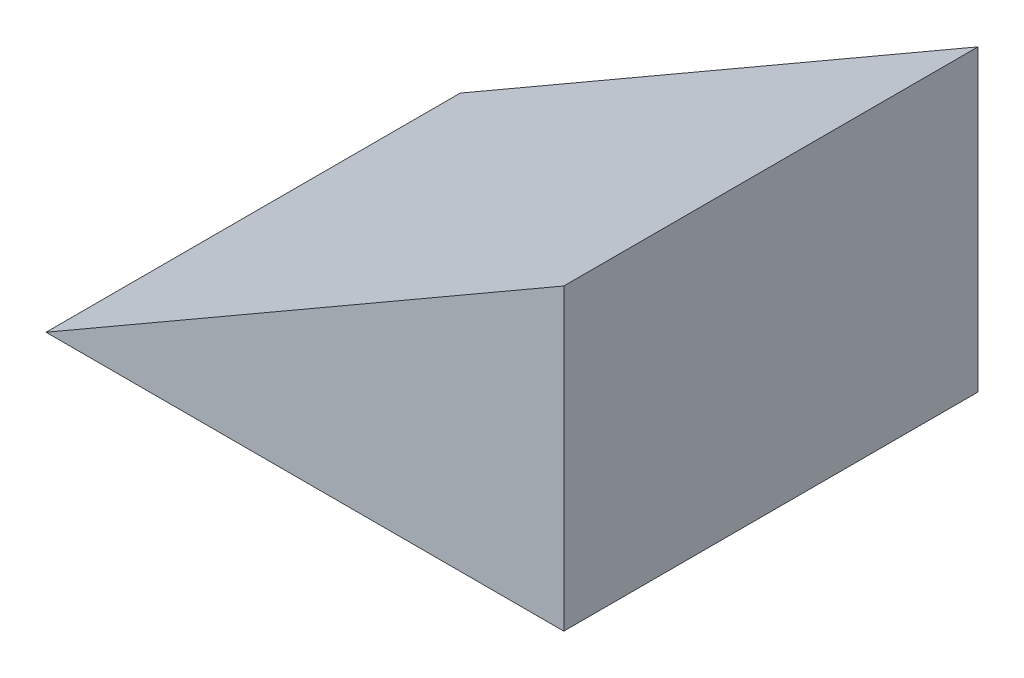
ISO-10303-21;
HEADER;
FILE_DESCRIPTION(('STEP AP214'),'2;1');
FILE_NAME('part.step','',(''),(''),'','','');
FILE_SCHEMA(('AUTOMOTIVE_DESIGN { 1 0 10303 214 1 1 1 1 }'));
ENDSEC;
DATA;
#1=APPLICATION_CONTEXT('core data for automotive mechanical design processes');
#2=APPLICATION_PROTOCOL_DEFINITION('international standard','automotive_design',2000,#1);
#3=PRODUCT_CONTEXT('',#1,'mechanical');
#4=PRODUCT('Part','Part','',(#3));
#5=PRODUCT_RELATED_PRODUCT_CATEGORY('part','',(#4));
#6=PRODUCT_DEFINITION_FORMATION('','',#4);
#7=PRODUCT_DEFINITION_CONTEXT('part definition',#1,'design');
#8=PRODUCT_DEFINITION('design','',#6,#7);
#9=PRODUCT_DEFINITION_SHAPE('','',#8);
#10=(LENGTH_UNIT() NAMED_UNIT(*) SI_UNIT(.MILLI.,.METRE.));
#11=(NAMED_UNIT(*) PLANE_ANGLE_UNIT() SI_UNIT($,.RADIAN.));
#12=(NAMED_UNIT(*) SI_UNIT($,.STERADIAN.) SOLID_ANGLE_UNIT());
#13=UNCERTAINTY_MEASURE_WITH_UNIT(LENGTH_MEASURE(1.E-05),#10,'distance_accuracy_value','');
#14=(GEOMETRIC_REPRESENTATION_CONTEXT(3) GLOBAL_UNCERTAINTY_ASSIGNED_CONTEXT((#13)) GLOBAL_UNIT_ASSIGNED_CONTEXT((#10,
#11,#12)) REPRESENTATION_CONTEXT('',''));
#15=CARTESIAN_POINT('',(0.,0.,0.));
#16=DIRECTION('',(0.,0.,1.));
#17=DIRECTION('',(1.,0.,0.));
#18=AXIS2_PLACEMENT_3D('',#15,#16,#17);
#19=CARTESIAN_POINT('',(-5.24414139265736,-14.3750620119451,8.));
#20=DIRECTION('',(0.499999999999995,-0.866025403784442,0.));
#21=DIRECTION('',(0.866025403784442,0.499999999999995,0.));
#22=AXIS2_PLACEMENT_3D('',#19,#20,#21);
#23=PLANE('',#22);
#24=DIRECTION('',(-0.866025403784442,-0.499999999999995,0.));
#25=VECTOR('',#24,1.);
#26=CARTESIAN_POINT('',(-5.24414139265736,-14.3750620119451,0.));
#27=LINE('',#26,#25);
#28=CARTESIAN_POINT('',(-5.24414139265736,-14.3750620119451,0.));
#29=VERTEX_POINT('',#28);
#30=CARTESIAN_POINT('',(-15.2441413926574,-20.1485647038413,0.));
#31=VERTEX_POINT('',#30);
#32=EDGE_CURVE('E89',#29,#31,#27,.T.);
#33=ORIENTED_EDGE('',*,*,#32,.T.);
#34=DIRECTION('',(0.,0.,-1.));
#35=VECTOR('',#34,1.);
#36=CARTESIAN_POINT('',(-15.2441413926574,-20.1485647038413,8.));
#37=LINE('',#36,#35);
#38=CARTESIAN_POINT('',(-15.2441413926574,-20.1485647038413,8.));
#39=VERTEX_POINT('',#38);
#40=EDGE_CURVE('E11',#39,#31,#37,.T.);
#41=ORIENTED_EDGE('',*,*,#40,.F.);
#42=DIRECTION('',(-0.866025403784442,-0.499999999999995,0.));
#43=VECTOR('',#42,1.);
#44=CARTESIAN_POINT('',(-5.24414139265736,-14.3750620119451,8.));
#45=LINE('',#44,#43);
#46=CARTESIAN_POINT('',(-5.24414139265736,-14.3750620119451,8.));
#47=VERTEX_POINT('',#46);
#48=EDGE_CURVE('E81',#47,#39,#45,.T.);
#49=ORIENTED_EDGE('',*,*,#48,.F.);
#50=DIRECTION('',(0.,0.,-1.));
#51=VECTOR('',#50,1.);
#52=CARTESIAN_POINT('',(-5.24414139265736,-14.3750620119451,8.));
#53=LINE('',#52,#51);
#54=EDGE_CURVE('E90',#47,#29,#53,.T.);
#55=ORIENTED_EDGE('',*,*,#54,.T.);
#56=EDGE_LOOP('',(#33,#41,#49,#55));
#57=FACE_BOUND('',#56,.T.);
#58=ADVANCED_FACE('F39',(#57),#23,.F.);
#59=CARTESIAN_POINT('',(-15.2441413926574,-20.1485647038413,8.));
#60=DIRECTION('',(0.,1.,0.));
#61=DIRECTION('',(-1.,0.,0.));
#62=AXIS2_PLACEMENT_3D('',#59,#60,#61);
#63=PLANE('',#62);
#64=DIRECTION('',(1.,0.,0.));
#65=VECTOR('',#64,1.);
#66=CARTESIAN_POINT('',(-15.2441413926574,-20.1485647038413,0.));
#67=LINE('',#66,#65);
#68=CARTESIAN_POINT('',(-5.24414139265736,-20.1485647038413,0.));
#69=VERTEX_POINT('',#68);
#70=EDGE_CURVE('E68',#31,#69,#67,.T.);
#71=ORIENTED_EDGE('',*,*,#70,.T.);
#72=DIRECTION('',(0.,0.,-1.));
#73=VECTOR('',#72,1.);
#74=CARTESIAN_POINT('',(-5.24414139265736,-20.1485647038413,8.));
#75=LINE('',#74,#73);
#76=CARTESIAN_POINT('',(-5.24414139265736,-20.1485647038413,8.));
#77=VERTEX_POINT('',#76);
#78=EDGE_CURVE('E48',#77,#69,#75,.T.);
#79=ORIENTED_EDGE('',*,*,#78,.F.);
#80=DIRECTION('',(1.,0.,0.));
#81=VECTOR('',#80,1.);
#82=CARTESIAN_POINT('',(-15.2441413926574,-20.1485647038413,8.));
#83=LINE('',#82,#81);
#84=EDGE_CURVE('E76',#39,#77,#83,.T.);
#85=ORIENTED_EDGE('',*,*,#84,.F.);
#86=ORIENTED_EDGE('',*,*,#40,.T.);
#87=EDGE_LOOP('',(#71,#79,#85,#86));
#88=FACE_BOUND('',#87,.T.);
#89=ADVANCED_FACE('F77',(#88),#63,.F.);
#90=CARTESIAN_POINT('',(-5.24414139265736,-20.1485647038413,8.));
#91=DIRECTION('',(-1.,0.,0.));
#92=DIRECTION('',(0.,0.,1.));
#93=AXIS2_PLACEMENT_3D('',#90,#91,#92);
#94=PLANE('',#93);
#95=DIRECTION('',(0.,1.,0.));
#96=VECTOR('',#95,1.);
#97=CARTESIAN_POINT('',(-5.24414139265736,-20.1485647038413,0.));
#98=LINE('',#97,#96);
#99=EDGE_CURVE('E73',#69,#29,#98,.T.);
#100=ORIENTED_EDGE('',*,*,#99,.T.);
#101=ORIENTED_EDGE('',*,*,#54,.F.);
#102=DIRECTION('',(0.,1.,0.));
#103=VECTOR('',#102,1.);
#104=CARTESIAN_POINT('',(-5.24414139265736,-20.1485647038413,8.));
#105=LINE('',#104,#103);
#106=EDGE_CURVE('E56',#77,#47,#105,.T.);
#107=ORIENTED_EDGE('',*,*,#106,.F.);
#108=ORIENTED_EDGE('',*,*,#78,.T.);
#109=EDGE_LOOP('',(#100,#101,#107,#108));
#110=FACE_BOUND('',#109,.T.);
#111=ADVANCED_FACE('F102',(#110),#94,.F.);
#112=CARTESIAN_POINT('',(0.,0.,8.));
#113=DIRECTION('',(0.,0.,-1.));
#114=DIRECTION('',(-1.,0.,0.));
#115=AXIS2_PLACEMENT_3D('',#112,#113,#114);
#116=PLANE('',#115);
#117=ORIENTED_EDGE('',*,*,#48,.T.);
#118=ORIENTED_EDGE('',*,*,#84,.T.);
#119=ORIENTED_EDGE('',*,*,#106,.T.);
#120=EDGE_LOOP('',(#117,#118,#119));
#121=FACE_BOUND('',#120,.T.);
#122=ADVANCED_FACE('F84',(#121),#116,.F.);
#123=CARTESIAN_POINT('',(0.,0.,0.));
#124=DIRECTION('',(0.,0.,-1.));
#125=DIRECTION('',(-1.,0.,0.));
#126=AXIS2_PLACEMENT_3D('',#123,#124,#125);
#127=PLANE('',#126);
#128=ORIENTED_EDGE('',*,*,#32,.F.);
#129=ORIENTED_EDGE('',*,*,#99,.F.);
#130=ORIENTED_EDGE('',*,*,#70,.F.);
#131=EDGE_LOOP('',(#128,#129,#130));
#132=FACE_BOUND('',#131,.T.);
#133=ADVANCED_FACE('F103',(#132),#127,.T.);
#134=CLOSED_SHELL('',(#58,#89,#111,#122,#133));
#135=MANIFOLD_SOLID_BREP('B2',#134);
#136=ADVANCED_BREP_SHAPE_REPRESENTATION('',(#18,#135),#14);
#137=SHAPE_DEFINITION_REPRESENTATION(#9,#136);
ENDSEC;
END-ISO-10303-21;
